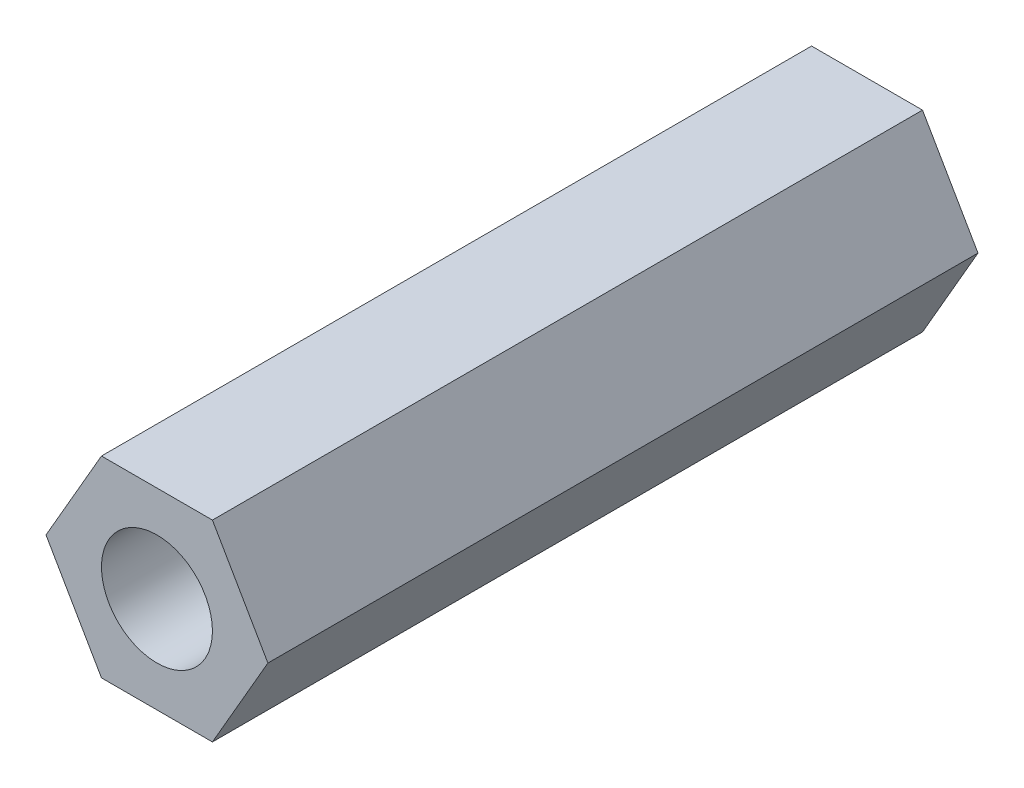
ISO-10303-21;
HEADER;
FILE_DESCRIPTION(('STEP AP214'),'2;1');
FILE_NAME('part.step','',(''),(''),'','','');
FILE_SCHEMA(('AUTOMOTIVE_DESIGN { 1 0 10303 214 1 1 1 1 }'));
ENDSEC;
DATA;
#1=APPLICATION_CONTEXT('core data for automotive mechanical design processes');
#2=APPLICATION_PROTOCOL_DEFINITION('international standard','automotive_design',2000,#1);
#3=PRODUCT_CONTEXT('',#1,'mechanical');
#4=PRODUCT('Part','Part','',(#3));
#5=PRODUCT_RELATED_PRODUCT_CATEGORY('part','',(#4));
#6=PRODUCT_DEFINITION_FORMATION('','',#4);
#7=PRODUCT_DEFINITION_CONTEXT('part definition',#1,'design');
#8=PRODUCT_DEFINITION('design','',#6,#7);
#9=PRODUCT_DEFINITION_SHAPE('','',#8);
#10=(LENGTH_UNIT() NAMED_UNIT(*) SI_UNIT(.MILLI.,.METRE.));
#11=(NAMED_UNIT(*) PLANE_ANGLE_UNIT() SI_UNIT($,.RADIAN.));
#12=(NAMED_UNIT(*) SI_UNIT($,.STERADIAN.) SOLID_ANGLE_UNIT());
#13=UNCERTAINTY_MEASURE_WITH_UNIT(LENGTH_MEASURE(1.E-05),#10,'distance_accuracy_value','');
#14=(GEOMETRIC_REPRESENTATION_CONTEXT(3) GLOBAL_UNCERTAINTY_ASSIGNED_CONTEXT((#13)) GLOBAL_UNIT_ASSIGNED_CONTEXT((#10,
#11,#12)) REPRESENTATION_CONTEXT('',''));
#15=CARTESIAN_POINT('',(0.,0.,0.));
#16=DIRECTION('',(0.,0.,1.));
#17=DIRECTION('',(1.,0.,0.));
#18=AXIS2_PLACEMENT_3D('',#15,#16,#17);
#19=CARTESIAN_POINT('',(-1.25,-2.1650635094611,16.));
#20=DIRECTION('',(0.866025403784439,-0.5,0.));
#21=DIRECTION('',(0.5,0.866025403784439,0.));
#22=AXIS2_PLACEMENT_3D('',#19,#20,#21);
#23=PLANE('',#22);
#24=DIRECTION('',(-0.5,-0.866025403784439,0.));
#25=VECTOR('',#24,1.);
#26=CARTESIAN_POINT('',(-1.25,-2.1650635094611,0.));
#27=LINE('',#26,#25);
#28=CARTESIAN_POINT('',(0.,0.,0.));
#29=VERTEX_POINT('',#28);
#30=CARTESIAN_POINT('',(-1.25,-2.1650635094611,0.));
#31=VERTEX_POINT('',#30);
#32=EDGE_CURVE('E125',#29,#31,#27,.T.);
#33=ORIENTED_EDGE('',*,*,#32,.T.);
#34=DIRECTION('',(0.,0.,-1.));
#35=VECTOR('',#34,1.);
#36=CARTESIAN_POINT('',(-1.25,-2.1650635094611,16.));
#37=LINE('',#36,#35);
#38=CARTESIAN_POINT('',(-1.25,-2.1650635094611,16.));
#39=VERTEX_POINT('',#38);
#40=EDGE_CURVE('E11',#39,#31,#37,.T.);
#41=ORIENTED_EDGE('',*,*,#40,.F.);
#42=DIRECTION('',(-0.5,-0.866025403784439,0.));
#43=VECTOR('',#42,1.);
#44=CARTESIAN_POINT('',(-1.25,-2.1650635094611,16.));
#45=LINE('',#44,#43);
#46=CARTESIAN_POINT('',(0.,0.,16.));
#47=VERTEX_POINT('',#46);
#48=EDGE_CURVE('E136',#47,#39,#45,.T.);
#49=ORIENTED_EDGE('',*,*,#48,.F.);
#50=DIRECTION('',(0.,0.,-1.));
#51=VECTOR('',#50,1.);
#52=CARTESIAN_POINT('',(0.,0.,16.));
#53=LINE('',#52,#51);
#54=EDGE_CURVE('E121',#47,#29,#53,.T.);
#55=ORIENTED_EDGE('',*,*,#54,.T.);
#56=EDGE_LOOP('',(#33,#41,#49,#55));
#57=FACE_BOUND('',#56,.T.);
#58=ADVANCED_FACE('F41',(#57),#23,.F.);
#59=CARTESIAN_POINT('',(0.,-4.33012701892219,16.));
#60=DIRECTION('',(0.866025403784439,0.5,0.));
#61=DIRECTION('',(-0.5,0.866025403784439,0.));
#62=AXIS2_PLACEMENT_3D('',#59,#60,#61);
#63=PLANE('',#62);
#64=DIRECTION('',(0.5,-0.866025403784439,0.));
#65=VECTOR('',#64,1.);
#66=CARTESIAN_POINT('',(0.,-4.33012701892219,0.));
#67=LINE('',#66,#65);
#68=CARTESIAN_POINT('',(0.,-4.33012701892219,0.));
#69=VERTEX_POINT('',#68);
#70=EDGE_CURVE('E128',#31,#69,#67,.T.);
#71=ORIENTED_EDGE('',*,*,#70,.T.);
#72=DIRECTION('',(0.,0.,-1.));
#73=VECTOR('',#72,1.);
#74=CARTESIAN_POINT('',(0.,-4.33012701892219,16.));
#75=LINE('',#74,#73);
#76=CARTESIAN_POINT('',(0.,-4.33012701892219,16.));
#77=VERTEX_POINT('',#76);
#78=EDGE_CURVE('E49',#77,#69,#75,.T.);
#79=ORIENTED_EDGE('',*,*,#78,.F.);
#80=DIRECTION('',(0.5,-0.866025403784439,0.));
#81=VECTOR('',#80,1.);
#82=CARTESIAN_POINT('',(0.,-4.33012701892219,16.));
#83=LINE('',#82,#81);
#84=EDGE_CURVE('E94',#39,#77,#83,.T.);
#85=ORIENTED_EDGE('',*,*,#84,.F.);
#86=ORIENTED_EDGE('',*,*,#40,.T.);
#87=EDGE_LOOP('',(#71,#79,#85,#86));
#88=FACE_BOUND('',#87,.T.);
#89=ADVANCED_FACE('F161',(#88),#63,.F.);
#90=CARTESIAN_POINT('',(2.5,-4.33012701892219,16.));
#91=DIRECTION('',(0.,1.,0.));
#92=DIRECTION('',(0.,0.,1.));
#93=AXIS2_PLACEMENT_3D('',#90,#91,#92);
#94=PLANE('',#93);
#95=DIRECTION('',(1.,0.,0.));
#96=VECTOR('',#95,1.);
#97=CARTESIAN_POINT('',(2.5,-4.33012701892219,0.));
#98=LINE('',#97,#96);
#99=CARTESIAN_POINT('',(2.5,-4.33012701892219,0.));
#100=VERTEX_POINT('',#99);
#101=EDGE_CURVE('E131',#69,#100,#98,.T.);
#102=ORIENTED_EDGE('',*,*,#101,.T.);
#103=DIRECTION('',(0.,0.,-1.));
#104=VECTOR('',#103,1.);
#105=CARTESIAN_POINT('',(2.5,-4.33012701892219,16.));
#106=LINE('',#105,#104);
#107=CARTESIAN_POINT('',(2.5,-4.33012701892219,16.));
#108=VERTEX_POINT('',#107);
#109=EDGE_CURVE('E116',#108,#100,#106,.T.);
#110=ORIENTED_EDGE('',*,*,#109,.F.);
#111=DIRECTION('',(1.,0.,0.));
#112=VECTOR('',#111,1.);
#113=CARTESIAN_POINT('',(2.5,-4.33012701892219,16.));
#114=LINE('',#113,#112);
#115=EDGE_CURVE('E107',#77,#108,#114,.T.);
#116=ORIENTED_EDGE('',*,*,#115,.F.);
#117=ORIENTED_EDGE('',*,*,#78,.T.);
#118=EDGE_LOOP('',(#102,#110,#116,#117));
#119=FACE_BOUND('',#118,.T.);
#120=ADVANCED_FACE('F142',(#119),#94,.F.);
#121=CARTESIAN_POINT('',(3.75,-2.1650635094611,16.));
#122=DIRECTION('',(-0.866025403784439,0.5,0.));
#123=DIRECTION('',(-0.5,-0.866025403784439,0.));
#124=AXIS2_PLACEMENT_3D('',#121,#122,#123);
#125=PLANE('',#124);
#126=DIRECTION('',(0.5,0.866025403784439,0.));
#127=VECTOR('',#126,1.);
#128=CARTESIAN_POINT('',(3.75,-2.1650635094611,0.));
#129=LINE('',#128,#127);
#130=CARTESIAN_POINT('',(3.75,-2.1650635094611,0.));
#131=VERTEX_POINT('',#130);
#132=EDGE_CURVE('E115',#100,#131,#129,.T.);
#133=ORIENTED_EDGE('',*,*,#132,.T.);
#134=DIRECTION('',(0.,0.,-1.));
#135=VECTOR('',#134,1.);
#136=CARTESIAN_POINT('',(3.75,-2.1650635094611,16.));
#137=LINE('',#136,#135);
#138=CARTESIAN_POINT('',(3.75,-2.1650635094611,16.));
#139=VERTEX_POINT('',#138);
#140=EDGE_CURVE('E112',#139,#131,#137,.T.);
#141=ORIENTED_EDGE('',*,*,#140,.F.);
#142=DIRECTION('',(0.5,0.866025403784439,0.));
#143=VECTOR('',#142,1.);
#144=CARTESIAN_POINT('',(3.75,-2.1650635094611,16.));
#145=LINE('',#144,#143);
#146=EDGE_CURVE('E101',#108,#139,#145,.T.);
#147=ORIENTED_EDGE('',*,*,#146,.F.);
#148=ORIENTED_EDGE('',*,*,#109,.T.);
#149=EDGE_LOOP('',(#133,#141,#147,#148));
#150=FACE_BOUND('',#149,.T.);
#151=ADVANCED_FACE('F113',(#150),#125,.F.);
#152=CARTESIAN_POINT('',(2.5,0.,16.));
#153=DIRECTION('',(-0.866025403784439,-0.5,0.));
#154=DIRECTION('',(0.5,-0.866025403784439,0.));
#155=AXIS2_PLACEMENT_3D('',#152,#153,#154);
#156=PLANE('',#155);
#157=DIRECTION('',(-0.5,0.866025403784439,0.));
#158=VECTOR('',#157,1.);
#159=CARTESIAN_POINT('',(2.5,0.,0.));
#160=LINE('',#159,#158);
#161=CARTESIAN_POINT('',(2.5,0.,0.));
#162=VERTEX_POINT('',#161);
#163=EDGE_CURVE('E80',#131,#162,#160,.T.);
#164=ORIENTED_EDGE('',*,*,#163,.T.);
#165=DIRECTION('',(0.,0.,-1.));
#166=VECTOR('',#165,1.);
#167=CARTESIAN_POINT('',(2.5,0.,16.));
#168=LINE('',#167,#166);
#169=CARTESIAN_POINT('',(2.5,0.,16.));
#170=VERTEX_POINT('',#169);
#171=EDGE_CURVE('E117',#170,#162,#168,.T.);
#172=ORIENTED_EDGE('',*,*,#171,.F.);
#173=DIRECTION('',(-0.5,0.866025403784439,0.));
#174=VECTOR('',#173,1.);
#175=CARTESIAN_POINT('',(2.5,0.,16.));
#176=LINE('',#175,#174);
#177=EDGE_CURVE('E105',#139,#170,#176,.T.);
#178=ORIENTED_EDGE('',*,*,#177,.F.);
#179=ORIENTED_EDGE('',*,*,#140,.T.);
#180=EDGE_LOOP('',(#164,#172,#178,#179));
#181=FACE_BOUND('',#180,.T.);
#182=ADVANCED_FACE('F119',(#181),#156,.F.);
#183=CARTESIAN_POINT('',(0.,0.,16.));
#184=DIRECTION('',(0.,-1.,0.));
#185=DIRECTION('',(0.,0.,-1.));
#186=AXIS2_PLACEMENT_3D('',#183,#184,#185);
#187=PLANE('',#186);
#188=DIRECTION('',(-1.,0.,0.));
#189=VECTOR('',#188,1.);
#190=CARTESIAN_POINT('',(0.,0.,0.));
#191=LINE('',#190,#189);
#192=EDGE_CURVE('E86',#162,#29,#191,.T.);
#193=ORIENTED_EDGE('',*,*,#192,.T.);
#194=ORIENTED_EDGE('',*,*,#54,.F.);
#195=DIRECTION('',(-1.,0.,0.));
#196=VECTOR('',#195,1.);
#197=CARTESIAN_POINT('',(0.,0.,16.));
#198=LINE('',#197,#196);
#199=EDGE_CURVE('E57',#170,#47,#198,.T.);
#200=ORIENTED_EDGE('',*,*,#199,.F.);
#201=ORIENTED_EDGE('',*,*,#171,.T.);
#202=EDGE_LOOP('',(#193,#194,#200,#201));
#203=FACE_BOUND('',#202,.T.);
#204=ADVANCED_FACE('F149',(#203),#187,.F.);
#205=CARTESIAN_POINT('',(0.,0.,16.));
#206=DIRECTION('',(0.,0.,-1.));
#207=DIRECTION('',(-1.,0.,0.));
#208=AXIS2_PLACEMENT_3D('',#205,#206,#207);
#209=PLANE('',#208);
#210=CARTESIAN_POINT('',(1.25,-2.1650635094611,16.));
#211=DIRECTION('',(0.,0.,1.));
#212=DIRECTION('',(1.,0.,0.));
#213=AXIS2_PLACEMENT_3D('',#210,#211,#212);
#214=CIRCLE('',#213,1.24999999999999);
#215=CARTESIAN_POINT('',(2.49999999999999,-2.1650635094611,16.));
#216=VERTEX_POINT('',#215);
#217=EDGE_CURVE('E208',#216,#216,#214,.T.);
#218=ORIENTED_EDGE('',*,*,#217,.F.);
#219=EDGE_LOOP('',(#218));
#220=FACE_BOUND('',#219,.T.);
#221=ORIENTED_EDGE('',*,*,#48,.T.);
#222=ORIENTED_EDGE('',*,*,#84,.T.);
#223=ORIENTED_EDGE('',*,*,#115,.T.);
#224=ORIENTED_EDGE('',*,*,#146,.T.);
#225=ORIENTED_EDGE('',*,*,#177,.T.);
#226=ORIENTED_EDGE('',*,*,#199,.T.);
#227=EDGE_LOOP('',(#221,#222,#223,#224,#225,#226));
#228=FACE_BOUND('',#227,.T.);
#229=ADVANCED_FACE('F103',(#220,#228),#209,.F.);
#230=CARTESIAN_POINT('',(0.,0.,0.));
#231=DIRECTION('',(0.,0.,-1.));
#232=DIRECTION('',(-1.,0.,0.));
#233=AXIS2_PLACEMENT_3D('',#230,#231,#232);
#234=PLANE('',#233);
#235=CARTESIAN_POINT('',(1.25,-2.1650635094611,0.));
#236=DIRECTION('',(0.,0.,1.));
#237=DIRECTION('',(1.,0.,0.));
#238=AXIS2_PLACEMENT_3D('',#235,#236,#237);
#239=CIRCLE('',#238,1.25);
#240=CARTESIAN_POINT('',(2.5,-2.1650635094611,0.));
#241=VERTEX_POINT('',#240);
#242=EDGE_CURVE('E129',#241,#241,#239,.T.);
#243=ORIENTED_EDGE('',*,*,#242,.T.);
#244=EDGE_LOOP('',(#243));
#245=FACE_BOUND('',#244,.T.);
#246=ORIENTED_EDGE('',*,*,#32,.F.);
#247=ORIENTED_EDGE('',*,*,#192,.F.);
#248=ORIENTED_EDGE('',*,*,#163,.F.);
#249=ORIENTED_EDGE('',*,*,#132,.F.);
#250=ORIENTED_EDGE('',*,*,#101,.F.);
#251=ORIENTED_EDGE('',*,*,#70,.F.);
#252=EDGE_LOOP('',(#246,#247,#248,#249,#250,#251));
#253=FACE_BOUND('',#252,.T.);
#254=ADVANCED_FACE('F145',(#245,#253),#234,.T.);
#255=CARTESIAN_POINT('',(1.25,-2.1650635094611,16.));
#256=DIRECTION('',(0.,0.,1.));
#257=DIRECTION('',(1.,0.,0.));
#258=AXIS2_PLACEMENT_3D('',#255,#256,#257);
#259=CYLINDRICAL_SURFACE('',#258,1.24999999999999);
#260=ORIENTED_EDGE('',*,*,#242,.F.);
#261=EDGE_LOOP('',(#260));
#262=FACE_BOUND('',#261,.T.);
#263=ORIENTED_EDGE('',*,*,#217,.T.);
#264=EDGE_LOOP('',(#263));
#265=FACE_BOUND('',#264,.T.);
#266=ADVANCED_FACE('F192',(#262,#265),#259,.F.);
#267=CLOSED_SHELL('',(#58,#89,#120,#151,#182,#204,#229,#254,#266));
#268=MANIFOLD_SOLID_BREP('B2',#267);
#269=ADVANCED_BREP_SHAPE_REPRESENTATION('',(#18,#268),#14);
#270=SHAPE_DEFINITION_REPRESENTATION(#9,#269);
ENDSEC;
END-ISO-10303-21;
